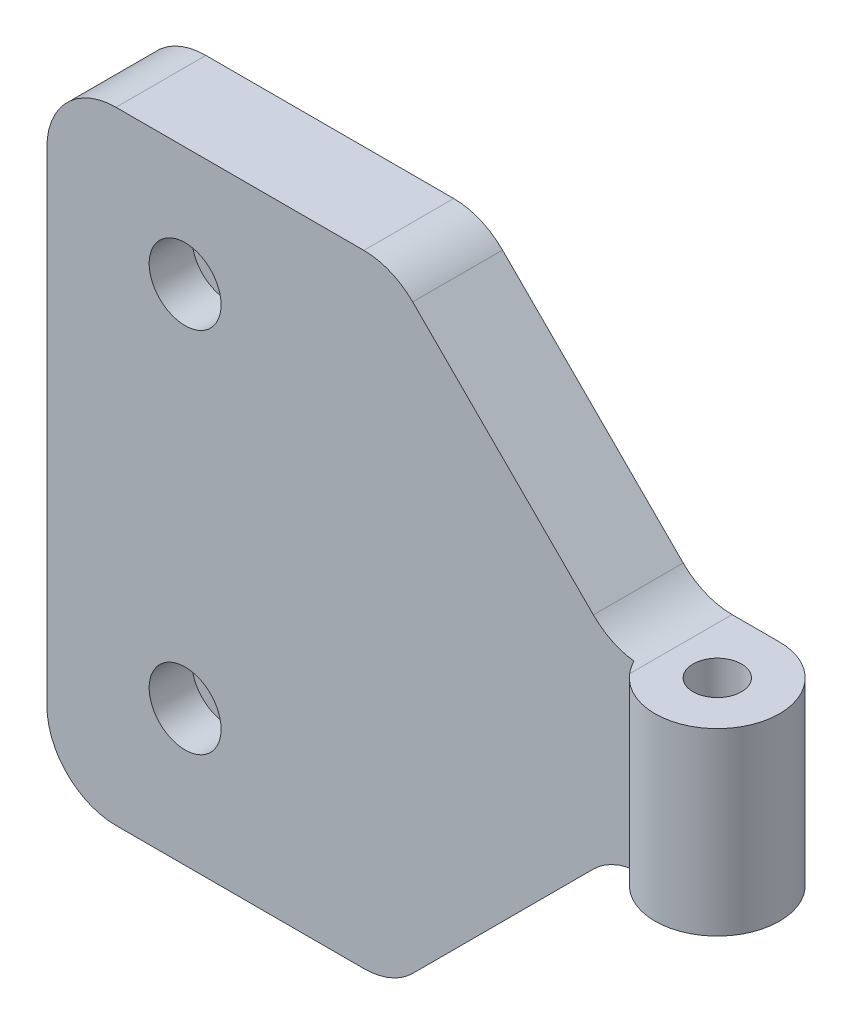
ISO-10303-21;
HEADER;
FILE_DESCRIPTION(('STEP AP214'),'2;1');
FILE_NAME('part.step','',(''),(''),'','','');
FILE_SCHEMA(('AUTOMOTIVE_DESIGN { 1 0 10303 214 1 1 1 1 }'));
ENDSEC;
DATA;
#1=APPLICATION_CONTEXT('core data for automotive mechanical design processes');
#2=APPLICATION_PROTOCOL_DEFINITION('international standard','automotive_design',2000,#1);
#3=PRODUCT_CONTEXT('',#1,'mechanical');
#4=PRODUCT('Part','Part','',(#3));
#5=PRODUCT_RELATED_PRODUCT_CATEGORY('part','',(#4));
#6=PRODUCT_DEFINITION_FORMATION('','',#4);
#7=PRODUCT_DEFINITION_CONTEXT('part definition',#1,'design');
#8=PRODUCT_DEFINITION('design','',#6,#7);
#9=PRODUCT_DEFINITION_SHAPE('','',#8);
#10=(LENGTH_UNIT() NAMED_UNIT(*) SI_UNIT(.MILLI.,.METRE.));
#11=(NAMED_UNIT(*) PLANE_ANGLE_UNIT() SI_UNIT($,.RADIAN.));
#12=(NAMED_UNIT(*) SI_UNIT($,.STERADIAN.) SOLID_ANGLE_UNIT());
#13=UNCERTAINTY_MEASURE_WITH_UNIT(LENGTH_MEASURE(1.E-05),#10,'distance_accuracy_value','');
#14=(GEOMETRIC_REPRESENTATION_CONTEXT(3) GLOBAL_UNCERTAINTY_ASSIGNED_CONTEXT((#13)) GLOBAL_UNIT_ASSIGNED_CONTEXT((#10,
#11,#12)) REPRESENTATION_CONTEXT('',''));
#15=CARTESIAN_POINT('',(0.,0.,0.));
#16=DIRECTION('',(0.,0.,1.));
#17=DIRECTION('',(1.,0.,0.));
#18=AXIS2_PLACEMENT_3D('',#15,#16,#17);
#19=CARTESIAN_POINT('',(0.,45.,-4.5));
#20=DIRECTION('',(0.,0.,-1.));
#21=DIRECTION('',(-1.,0.,0.));
#22=AXIS2_PLACEMENT_3D('',#19,#20,#21);
#23=PLANE('',#22);
#24=CARTESIAN_POINT('',(-36.5,36.4173359920842,-4.5));
#25=DIRECTION('',(0.,0.,-1.));
#26=DIRECTION('',(-1.,0.,0.));
#27=AXIS2_PLACEMENT_3D('',#24,#25,#26);
#28=CIRCLE('',#27,5.5);
#29=CARTESIAN_POINT('',(-42.,36.4173359920842,-4.5));
#30=VERTEX_POINT('',#29);
#31=EDGE_CURVE('E333',#30,#30,#28,.T.);
#32=ORIENTED_EDGE('',*,*,#31,.F.);
#33=EDGE_LOOP('',(#32));
#34=FACE_BOUND('',#33,.T.);
#35=CARTESIAN_POINT('',(-36.5,9.83294171594909,-4.5));
#36=DIRECTION('',(0.,0.,-1.));
#37=DIRECTION('',(-1.,0.,0.));
#38=AXIS2_PLACEMENT_3D('',#35,#36,#37);
#39=CIRCLE('',#38,5.5);
#40=CARTESIAN_POINT('',(-42.,9.83294171594909,-4.5));
#41=VERTEX_POINT('',#40);
#42=EDGE_CURVE('E324',#41,#41,#39,.T.);
#43=ORIENTED_EDGE('',*,*,#42,.F.);
#44=EDGE_LOOP('',(#43));
#45=FACE_BOUND('',#44,.T.);
#46=DIRECTION('',(0.707106781186544,0.707106781186551,0.));
#47=VECTOR('',#46,1.);
#48=CARTESIAN_POINT('',(-10.7500000000001,10.75,-4.5));
#49=LINE('',#48,#47);
#50=CARTESIAN_POINT('',(-20.0355339059327,1.46446609406728,-4.5));
#51=VERTEX_POINT('',#50);
#52=CARTESIAN_POINT('',(-6.96446609406744,14.5355339059327,-4.5));
#53=VERTEX_POINT('',#52);
#54=EDGE_CURVE('E327',#51,#53,#49,.T.);
#55=ORIENTED_EDGE('',*,*,#54,.F.);
#56=CARTESIAN_POINT('',(-23.5710678118655,5.,-4.5));
#57=DIRECTION('',(0.,0.,-1.));
#58=DIRECTION('',(-1.,0.,0.));
#59=AXIS2_PLACEMENT_3D('',#56,#57,#58);
#60=CIRCLE('',#59,5.);
#61=CARTESIAN_POINT('',(-23.5710678118655,0.,-4.5));
#62=VERTEX_POINT('',#61);
#63=EDGE_CURVE('E232',#51,#62,#60,.T.);
#64=ORIENTED_EDGE('',*,*,#63,.T.);
#65=DIRECTION('',(1.,0.,0.));
#66=VECTOR('',#65,1.);
#67=CARTESIAN_POINT('',(0.,0.,-4.5));
#68=LINE('',#67,#66);
#69=CARTESIAN_POINT('',(-41.5,0.,-4.5));
#70=VERTEX_POINT('',#69);
#71=EDGE_CURVE('E167',#70,#62,#68,.T.);
#72=ORIENTED_EDGE('',*,*,#71,.F.);
#73=CARTESIAN_POINT('',(-41.5,5.,-4.5));
#74=DIRECTION('',(0.,0.,-1.));
#75=DIRECTION('',(-1.,0.,0.));
#76=AXIS2_PLACEMENT_3D('',#73,#74,#75);
#77=CIRCLE('',#76,5.);
#78=CARTESIAN_POINT('',(-46.5,5.00000000000001,-4.5));
#79=VERTEX_POINT('',#78);
#80=EDGE_CURVE('E197',#70,#79,#77,.T.);
#81=ORIENTED_EDGE('',*,*,#80,.T.);
#82=DIRECTION('',(0.,-1.,0.));
#83=VECTOR('',#82,1.);
#84=CARTESIAN_POINT('',(-46.5,45.,-4.5));
#85=LINE('',#84,#83);
#86=CARTESIAN_POINT('',(-46.5,40.,-4.5));
#87=VERTEX_POINT('',#86);
#88=EDGE_CURVE('E189',#87,#79,#85,.T.);
#89=ORIENTED_EDGE('',*,*,#88,.F.);
#90=CARTESIAN_POINT('',(-41.5,40.,-4.5));
#91=DIRECTION('',(0.,0.,-1.));
#92=DIRECTION('',(-1.,0.,0.));
#93=AXIS2_PLACEMENT_3D('',#90,#91,#92);
#94=CIRCLE('',#93,5.);
#95=CARTESIAN_POINT('',(-41.5,45.,-4.5));
#96=VERTEX_POINT('',#95);
#97=EDGE_CURVE('E195',#87,#96,#94,.T.);
#98=ORIENTED_EDGE('',*,*,#97,.T.);
#99=DIRECTION('',(1.,0.,0.));
#100=VECTOR('',#99,1.);
#101=CARTESIAN_POINT('',(0.,45.,-4.5));
#102=LINE('',#101,#100);
#103=CARTESIAN_POINT('',(-23.5710678118655,45.,-4.5));
#104=VERTEX_POINT('',#103);
#105=EDGE_CURVE('E177',#96,#104,#102,.T.);
#106=ORIENTED_EDGE('',*,*,#105,.T.);
#107=CARTESIAN_POINT('',(-23.5710678118655,40.,-4.5));
#108=DIRECTION('',(0.,0.,-1.));
#109=DIRECTION('',(-1.,0.,0.));
#110=AXIS2_PLACEMENT_3D('',#107,#108,#109);
#111=CIRCLE('',#110,5.);
#112=CARTESIAN_POINT('',(-20.0355339059327,43.5355339059327,-4.5));
#113=VERTEX_POINT('',#112);
#114=EDGE_CURVE('E230',#104,#113,#111,.T.);
#115=ORIENTED_EDGE('',*,*,#114,.T.);
#116=DIRECTION('',(-0.707106781186543,0.707106781186552,0.));
#117=VECTOR('',#116,1.);
#118=CARTESIAN_POINT('',(11.7499999999999,11.7499999999997,-4.5));
#119=LINE('',#118,#117);
#120=CARTESIAN_POINT('',(-6.96446609406744,30.4644660940673,-4.5));
#121=VERTEX_POINT('',#120);
#122=EDGE_CURVE('E628',#121,#113,#119,.T.);
#123=ORIENTED_EDGE('',*,*,#122,.F.);
#124=CARTESIAN_POINT('',(-3.42893218813469,34.,-4.5));
#125=DIRECTION('',(0.,0.,-1.));
#126=DIRECTION('',(-1.,0.,0.));
#127=AXIS2_PLACEMENT_3D('',#124,#125,#126);
#128=CIRCLE('',#127,5.);
#129=CARTESIAN_POINT('',(-3.42893218813469,29.,-4.5));
#130=VERTEX_POINT('',#129);
#131=EDGE_CURVE('E149',#121,#130,#128,.F.);
#132=ORIENTED_EDGE('',*,*,#131,.T.);
#133=DIRECTION('',(1.,0.,0.));
#134=VECTOR('',#133,1.);
#135=CARTESIAN_POINT('',(0.,29.,-4.5));
#136=LINE('',#135,#134);
#137=CARTESIAN_POINT('',(0.,29.,-4.5));
#138=VERTEX_POINT('',#137);
#139=EDGE_CURVE('E142',#130,#138,#136,.T.);
#140=ORIENTED_EDGE('',*,*,#139,.T.);
#141=DIRECTION('',(0.,-1.,0.));
#142=VECTOR('',#141,1.);
#143=CARTESIAN_POINT('',(0.,29.,-4.5));
#144=LINE('',#143,#142);
#145=CARTESIAN_POINT('',(0.,16.,-4.5));
#146=VERTEX_POINT('',#145);
#147=EDGE_CURVE('E147',#146,#138,#144,.F.);
#148=ORIENTED_EDGE('',*,*,#147,.F.);
#149=DIRECTION('',(1.,0.,0.));
#150=VECTOR('',#149,1.);
#151=CARTESIAN_POINT('',(0.,16.,-4.5));
#152=LINE('',#151,#150);
#153=CARTESIAN_POINT('',(-3.42893218813468,16.,-4.5));
#154=VERTEX_POINT('',#153);
#155=EDGE_CURVE('E341',#154,#146,#152,.T.);
#156=ORIENTED_EDGE('',*,*,#155,.F.);
#157=CARTESIAN_POINT('',(-3.42893218813468,11.,-4.5));
#158=DIRECTION('',(0.,0.,-1.));
#159=DIRECTION('',(-1.,0.,0.));
#160=AXIS2_PLACEMENT_3D('',#157,#158,#159);
#161=CIRCLE('',#160,5.);
#162=EDGE_CURVE('E627',#154,#53,#161,.F.);
#163=ORIENTED_EDGE('',*,*,#162,.T.);
#164=EDGE_LOOP('',(#55,#64,#72,#81,#89,#98,#106,#115,#123,#132,#140,#148,#156,#163));
#165=FACE_BOUND('',#164,.T.);
#166=ADVANCED_FACE('F39',(#34,#45,#165),#23,.T.);
#167=CARTESIAN_POINT('',(0.,45.,2.));
#168=DIRECTION('',(0.,0.,-1.));
#169=DIRECTION('',(-1.,0.,0.));
#170=AXIS2_PLACEMENT_3D('',#167,#168,#169);
#171=PLANE('',#170);
#172=CARTESIAN_POINT('',(-36.5,36.4173359920842,2.));
#173=DIRECTION('',(0.,0.,1.));
#174=DIRECTION('',(1.,0.,0.));
#175=AXIS2_PLACEMENT_3D('',#172,#173,#174);
#176=CIRCLE('',#175,2.6);
#177=CARTESIAN_POINT('',(-33.9,36.4173359920842,2.));
#178=VERTEX_POINT('',#177);
#179=EDGE_CURVE('E338',#178,#178,#176,.T.);
#180=ORIENTED_EDGE('',*,*,#179,.F.);
#181=EDGE_LOOP('',(#180));
#182=FACE_BOUND('',#181,.T.);
#183=CARTESIAN_POINT('',(-36.5,9.83294171594909,2.));
#184=DIRECTION('',(0.,0.,1.));
#185=DIRECTION('',(1.,0.,0.));
#186=AXIS2_PLACEMENT_3D('',#183,#184,#185);
#187=CIRCLE('',#186,2.6);
#188=CARTESIAN_POINT('',(-33.9,9.83294171594909,2.));
#189=VERTEX_POINT('',#188);
#190=EDGE_CURVE('E152',#189,#189,#187,.T.);
#191=ORIENTED_EDGE('',*,*,#190,.F.);
#192=EDGE_LOOP('',(#191));
#193=FACE_BOUND('',#192,.T.);
#194=DIRECTION('',(1.,0.,0.));
#195=VECTOR('',#194,1.);
#196=CARTESIAN_POINT('',(0.,0.,2.));
#197=LINE('',#196,#195);
#198=CARTESIAN_POINT('',(-41.5,0.,2.));
#199=VERTEX_POINT('',#198);
#200=CARTESIAN_POINT('',(-23.5710678118655,0.,2.));
#201=VERTEX_POINT('',#200);
#202=EDGE_CURVE('E170',#199,#201,#197,.T.);
#203=ORIENTED_EDGE('',*,*,#202,.T.);
#204=CARTESIAN_POINT('',(-23.5710678118655,5.,2.));
#205=DIRECTION('',(0.,0.,-1.));
#206=DIRECTION('',(-1.,0.,0.));
#207=AXIS2_PLACEMENT_3D('',#204,#205,#206);
#208=CIRCLE('',#207,5.);
#209=CARTESIAN_POINT('',(-20.0355339059327,1.46446609406729,2.));
#210=VERTEX_POINT('',#209);
#211=EDGE_CURVE('E238',#201,#210,#208,.F.);
#212=ORIENTED_EDGE('',*,*,#211,.T.);
#213=DIRECTION('',(0.707106781186544,0.707106781186551,0.));
#214=VECTOR('',#213,1.);
#215=CARTESIAN_POINT('',(11.7499999999999,33.2500000000002,2.));
#216=LINE('',#215,#214);
#217=CARTESIAN_POINT('',(-6.96446609406744,14.5355339059327,2.));
#218=VERTEX_POINT('',#217);
#219=EDGE_CURVE('E314',#210,#218,#216,.T.);
#220=ORIENTED_EDGE('',*,*,#219,.T.);
#221=CARTESIAN_POINT('',(-3.42893218813468,11.,2.));
#222=DIRECTION('',(0.,0.,-1.));
#223=DIRECTION('',(-1.,0.,0.));
#224=AXIS2_PLACEMENT_3D('',#221,#222,#223);
#225=CIRCLE('',#224,5.);
#226=CARTESIAN_POINT('',(-4.03112887414927,15.963603444208,2.));
#227=VERTEX_POINT('',#226);
#228=EDGE_CURVE('E53',#218,#227,#225,.T.);
#229=ORIENTED_EDGE('',*,*,#228,.T.);
#230=DIRECTION('',(0.,-1.,0.));
#231=VECTOR('',#230,1.);
#232=CARTESIAN_POINT('',(-4.03112887414927,45.,2.));
#233=LINE('',#232,#231);
#234=CARTESIAN_POINT('',(-4.03112887414927,29.036396555792,2.));
#235=VERTEX_POINT('',#234);
#236=EDGE_CURVE('E59',#235,#227,#233,.T.);
#237=ORIENTED_EDGE('',*,*,#236,.F.);
#238=CARTESIAN_POINT('',(-3.42893218813469,34.,2.));
#239=DIRECTION('',(0.,0.,-1.));
#240=DIRECTION('',(-1.,0.,0.));
#241=AXIS2_PLACEMENT_3D('',#238,#239,#240);
#242=CIRCLE('',#241,5.);
#243=CARTESIAN_POINT('',(-6.96446609406744,30.4644660940673,2.));
#244=VERTEX_POINT('',#243);
#245=EDGE_CURVE('E251',#235,#244,#242,.T.);
#246=ORIENTED_EDGE('',*,*,#245,.T.);
#247=DIRECTION('',(-0.707106781186543,0.707106781186552,0.));
#248=VECTOR('',#247,1.);
#249=CARTESIAN_POINT('',(-10.7500000000001,34.25,2.));
#250=LINE('',#249,#248);
#251=CARTESIAN_POINT('',(-20.0355339059327,43.5355339059327,2.));
#252=VERTEX_POINT('',#251);
#253=EDGE_CURVE('E321',#244,#252,#250,.T.);
#254=ORIENTED_EDGE('',*,*,#253,.T.);
#255=CARTESIAN_POINT('',(-23.5710678118655,40.,2.));
#256=DIRECTION('',(0.,0.,-1.));
#257=DIRECTION('',(-1.,0.,0.));
#258=AXIS2_PLACEMENT_3D('',#255,#256,#257);
#259=CIRCLE('',#258,5.);
#260=CARTESIAN_POINT('',(-23.5710678118655,45.,2.));
#261=VERTEX_POINT('',#260);
#262=EDGE_CURVE('E236',#252,#261,#259,.F.);
#263=ORIENTED_EDGE('',*,*,#262,.T.);
#264=DIRECTION('',(1.,0.,0.));
#265=VECTOR('',#264,1.);
#266=CARTESIAN_POINT('',(0.,45.,2.));
#267=LINE('',#266,#265);
#268=CARTESIAN_POINT('',(-41.5,45.,2.));
#269=VERTEX_POINT('',#268);
#270=EDGE_CURVE('E180',#269,#261,#267,.T.);
#271=ORIENTED_EDGE('',*,*,#270,.F.);
#272=CARTESIAN_POINT('',(-41.5,40.,2.));
#273=DIRECTION('',(0.,0.,-1.));
#274=DIRECTION('',(-1.,0.,0.));
#275=AXIS2_PLACEMENT_3D('',#272,#273,#274);
#276=CIRCLE('',#275,5.);
#277=CARTESIAN_POINT('',(-46.5,40.,2.));
#278=VERTEX_POINT('',#277);
#279=EDGE_CURVE('E204',#269,#278,#276,.F.);
#280=ORIENTED_EDGE('',*,*,#279,.T.);
#281=DIRECTION('',(0.,-1.,0.));
#282=VECTOR('',#281,1.);
#283=CARTESIAN_POINT('',(-46.5,45.,2.));
#284=LINE('',#283,#282);
#285=CARTESIAN_POINT('',(-46.5,5.00000000000001,2.));
#286=VERTEX_POINT('',#285);
#287=EDGE_CURVE('E186',#278,#286,#284,.T.);
#288=ORIENTED_EDGE('',*,*,#287,.T.);
#289=CARTESIAN_POINT('',(-41.5,5.,2.));
#290=DIRECTION('',(0.,0.,-1.));
#291=DIRECTION('',(-1.,0.,0.));
#292=AXIS2_PLACEMENT_3D('',#289,#290,#291);
#293=CIRCLE('',#292,5.);
#294=EDGE_CURVE('E206',#286,#199,#293,.F.);
#295=ORIENTED_EDGE('',*,*,#294,.T.);
#296=EDGE_LOOP('',(#203,#212,#220,#229,#237,#246,#254,#263,#271,#280,#288,#295));
#297=FACE_BOUND('',#296,.T.);
#298=ADVANCED_FACE('F277',(#182,#193,#297),#171,.F.);
#299=CARTESIAN_POINT('',(-36.5,9.83294171594909,-13.));
#300=DIRECTION('',(0.,0.,1.));
#301=DIRECTION('',(1.,0.,0.));
#302=AXIS2_PLACEMENT_3D('',#299,#300,#301);
#303=CYLINDRICAL_SURFACE('',#302,2.6);
#304=ORIENTED_EDGE('',*,*,#190,.T.);
#305=EDGE_LOOP('',(#304));
#306=FACE_BOUND('',#305,.T.);
#307=CARTESIAN_POINT('',(-36.5,9.83294171594909,-1.1));
#308=DIRECTION('',(0.,0.,-1.));
#309=DIRECTION('',(-1.,0.,0.));
#310=AXIS2_PLACEMENT_3D('',#307,#308,#309);
#311=CIRCLE('',#310,2.6);
#312=CARTESIAN_POINT('',(-39.1,9.83294171594909,-1.1));
#313=VERTEX_POINT('',#312);
#314=EDGE_CURVE('E213',#313,#313,#311,.F.);
#315=ORIENTED_EDGE('',*,*,#314,.F.);
#316=EDGE_LOOP('',(#315));
#317=FACE_BOUND('',#316,.T.);
#318=ADVANCED_FACE('F283',(#306,#317),#303,.F.);
#319=CARTESIAN_POINT('',(-36.5,36.4173359920842,-13.));
#320=DIRECTION('',(0.,0.,1.));
#321=DIRECTION('',(1.,0.,0.));
#322=AXIS2_PLACEMENT_3D('',#319,#320,#321);
#323=CYLINDRICAL_SURFACE('',#322,2.6);
#324=ORIENTED_EDGE('',*,*,#179,.T.);
#325=EDGE_LOOP('',(#324));
#326=FACE_BOUND('',#325,.T.);
#327=CARTESIAN_POINT('',(-36.5,36.4173359920842,-1.1));
#328=DIRECTION('',(0.,0.,-1.));
#329=DIRECTION('',(-1.,0.,0.));
#330=AXIS2_PLACEMENT_3D('',#327,#328,#329);
#331=CIRCLE('',#330,2.6);
#332=CARTESIAN_POINT('',(-39.1,36.4173359920842,-1.1));
#333=VERTEX_POINT('',#332);
#334=EDGE_CURVE('E210',#333,#333,#331,.F.);
#335=ORIENTED_EDGE('',*,*,#334,.F.);
#336=EDGE_LOOP('',(#335));
#337=FACE_BOUND('',#336,.T.);
#338=ADVANCED_FACE('F360',(#326,#337),#323,.F.);
#339=CARTESIAN_POINT('',(-46.5,45.,0.));
#340=DIRECTION('',(-1.,0.,0.));
#341=DIRECTION('',(0.,0.,1.));
#342=AXIS2_PLACEMENT_3D('',#339,#340,#341);
#343=PLANE('',#342);
#344=ORIENTED_EDGE('',*,*,#88,.T.);
#345=DIRECTION('',(0.,0.,-1.));
#346=VECTOR('',#345,1.);
#347=CARTESIAN_POINT('',(-46.5,5.,2.));
#348=LINE('',#347,#346);
#349=EDGE_CURVE('E202',#79,#286,#348,.F.);
#350=ORIENTED_EDGE('',*,*,#349,.T.);
#351=ORIENTED_EDGE('',*,*,#287,.F.);
#352=DIRECTION('',(0.,0.,-1.));
#353=VECTOR('',#352,1.);
#354=CARTESIAN_POINT('',(-46.5,40.,0.));
#355=LINE('',#354,#353);
#356=EDGE_CURVE('E199',#278,#87,#355,.T.);
#357=ORIENTED_EDGE('',*,*,#356,.T.);
#358=EDGE_LOOP('',(#344,#350,#351,#357));
#359=FACE_BOUND('',#358,.T.);
#360=ADVANCED_FACE('F289',(#359),#343,.T.);
#361=CARTESIAN_POINT('',(0.,45.,0.));
#362=DIRECTION('',(0.,1.,0.));
#363=DIRECTION('',(0.,0.,1.));
#364=AXIS2_PLACEMENT_3D('',#361,#362,#363);
#365=PLANE('',#364);
#366=ORIENTED_EDGE('',*,*,#270,.T.);
#367=DIRECTION('',(0.,0.,-1.));
#368=VECTOR('',#367,1.);
#369=CARTESIAN_POINT('',(-23.5710678118655,45.,-4.5));
#370=LINE('',#369,#368);
#371=EDGE_CURVE('E240',#261,#104,#370,.T.);
#372=ORIENTED_EDGE('',*,*,#371,.T.);
#373=ORIENTED_EDGE('',*,*,#105,.F.);
#374=DIRECTION('',(0.,0.,-1.));
#375=VECTOR('',#374,1.);
#376=CARTESIAN_POINT('',(-41.5,45.,0.));
#377=LINE('',#376,#375);
#378=EDGE_CURVE('E208',#96,#269,#377,.F.);
#379=ORIENTED_EDGE('',*,*,#378,.T.);
#380=EDGE_LOOP('',(#366,#372,#373,#379));
#381=FACE_BOUND('',#380,.T.);
#382=ADVANCED_FACE('F541',(#381),#365,.T.);
#383=CARTESIAN_POINT('',(0.,0.,0.));
#384=DIRECTION('',(0.,1.,0.));
#385=DIRECTION('',(0.,0.,1.));
#386=AXIS2_PLACEMENT_3D('',#383,#384,#385);
#387=PLANE('',#386);
#388=ORIENTED_EDGE('',*,*,#71,.T.);
#389=DIRECTION('',(0.,0.,-1.));
#390=VECTOR('',#389,1.);
#391=CARTESIAN_POINT('',(-23.5710678118655,0.,0.));
#392=LINE('',#391,#390);
#393=EDGE_CURVE('E234',#62,#201,#392,.F.);
#394=ORIENTED_EDGE('',*,*,#393,.T.);
#395=ORIENTED_EDGE('',*,*,#202,.F.);
#396=DIRECTION('',(0.,0.,-1.));
#397=VECTOR('',#396,1.);
#398=CARTESIAN_POINT('',(-41.5,0.,-4.5));
#399=LINE('',#398,#397);
#400=EDGE_CURVE('E192',#199,#70,#399,.T.);
#401=ORIENTED_EDGE('',*,*,#400,.T.);
#402=EDGE_LOOP('',(#388,#394,#395,#401));
#403=FACE_BOUND('',#402,.T.);
#404=ADVANCED_FACE('F308',(#403),#387,.F.);
#405=CARTESIAN_POINT('',(0.,29.,0.));
#406=DIRECTION('',(0.,-1.,0.));
#407=DIRECTION('',(0.,0.,-1.));
#408=AXIS2_PLACEMENT_3D('',#405,#406,#407);
#409=CYLINDRICAL_SURFACE('',#408,4.5);
#410=ORIENTED_EDGE('',*,*,#236,.T.);
#411=CARTESIAN_POINT('',(-4.03112887414927,15.963603444208,2.));
#412=CARTESIAN_POINT('',(-3.99044075026024,15.9685359860328,2.08201601896047));
#413=CARTESIAN_POINT('',(-3.94723840239108,15.9732735935633,2.16279984020572));
#414=CARTESIAN_POINT('',(-3.85614500221616,15.9819257381548,2.32130627109028));
#415=CARTESIAN_POINT('',(-3.80827278910433,15.9858433968808,2.39903954044826));
#416=CARTESIAN_POINT('',(-3.70785952142706,15.9924672480451,2.55149124831842));
#417=CARTESIAN_POINT('',(-3.65531831770198,15.9951734017629,2.62620959040215));
#418=CARTESIAN_POINT('',(-3.54555657951766,15.9989420566335,2.77262370194589));
#419=CARTESIAN_POINT('',(-3.48831861620373,15.999998114718,2.8443065649609));
#420=CARTESIAN_POINT('',(-3.42893218813468,16.,2.91417639294088));
#421=B_SPLINE_CURVE_WITH_KNOTS('',3,(#411,#412,#413,#414,#415,#416,#417,#418,#419,#420),
.UNSPECIFIED.,.F.,.F.,(4,2,2,2,4),(0.,0.275022367969424,0.548977833343628,0.822942053886143,
1.09797336284784),.UNSPECIFIED.);
#422=CARTESIAN_POINT('',(-3.42893218813468,16.,2.91417639294088));
#423=VERTEX_POINT('',#422);
#424=EDGE_CURVE('E11',#227,#423,#421,.T.);
#425=ORIENTED_EDGE('',*,*,#424,.T.);
#426=CARTESIAN_POINT('',(0.,16.,0.));
#427=DIRECTION('',(0.,1.,0.));
#428=DIRECTION('',(0.,0.,1.));
#429=AXIS2_PLACEMENT_3D('',#426,#427,#428);
#430=CIRCLE('',#429,4.5);
#431=EDGE_CURVE('E165',#423,#146,#430,.T.);
#432=ORIENTED_EDGE('',*,*,#431,.T.);
#433=ORIENTED_EDGE('',*,*,#147,.T.);
#434=CARTESIAN_POINT('',(0.,29.,0.));
#435=DIRECTION('',(0.,1.,0.));
#436=DIRECTION('',(0.,0.,1.));
#437=AXIS2_PLACEMENT_3D('',#434,#435,#436);
#438=CIRCLE('',#437,4.5);
#439=CARTESIAN_POINT('',(-3.42893218813469,29.,2.91417639294087));
#440=VERTEX_POINT('',#439);
#441=EDGE_CURVE('E156',#440,#138,#438,.T.);
#442=ORIENTED_EDGE('',*,*,#441,.F.);
#443=CARTESIAN_POINT('',(-3.42893218813469,29.,2.91417639294087));
#444=CARTESIAN_POINT('',(-3.48831861620374,29.000001885282,2.84430656496089));
#445=CARTESIAN_POINT('',(-3.54555657951766,29.0010579433665,2.77262370194588));
#446=CARTESIAN_POINT('',(-3.65531831770198,29.0048265982371,2.62620959040215));
#447=CARTESIAN_POINT('',(-3.70785952142706,29.0075327519549,2.55149124831842));
#448=CARTESIAN_POINT('',(-3.80827278910433,29.0141566031192,2.39903954044826));
#449=CARTESIAN_POINT('',(-3.85614500221616,29.0180742618452,2.32130627109028));
#450=CARTESIAN_POINT('',(-3.94723840239108,29.0267264064367,2.16279984020572));
#451=CARTESIAN_POINT('',(-3.99044075026024,29.0314640139672,2.08201601896047));
#452=CARTESIAN_POINT('',(-4.03112887414927,29.036396555792,2.));
#453=B_SPLINE_CURVE_WITH_KNOTS('',3,(#443,#444,#445,#446,#447,#448,#449,#450,#451,#452),
.UNSPECIFIED.,.F.,.F.,(4,2,2,2,4),(0.,0.275031308961691,0.548995529504205,0.822950994878407,
1.09797336284783),.UNSPECIFIED.);
#454=EDGE_CURVE('E244',#440,#235,#453,.T.);
#455=ORIENTED_EDGE('',*,*,#454,.T.);
#456=EDGE_LOOP('',(#410,#425,#432,#433,#442,#455));
#457=FACE_BOUND('',#456,.T.);
#458=ADVANCED_FACE('F163',(#457),#409,.T.);
#459=CARTESIAN_POINT('',(0.,29.,0.));
#460=DIRECTION('',(0.,-1.,0.));
#461=DIRECTION('',(0.,0.,-1.));
#462=AXIS2_PLACEMENT_3D('',#459,#460,#461);
#463=CYLINDRICAL_SURFACE('',#462,1.75);
#464=CARTESIAN_POINT('',(0.,29.,0.));
#465=DIRECTION('',(0.,1.,0.));
#466=DIRECTION('',(0.,0.,1.));
#467=AXIS2_PLACEMENT_3D('',#464,#465,#466);
#468=CIRCLE('',#467,1.75);
#469=CARTESIAN_POINT('',(0.,29.,-1.75));
#470=VERTEX_POINT('',#469);
#471=EDGE_CURVE('E160',#470,#470,#468,.T.);
#472=CARTESIAN_POINT('',(0.,16.,0.));
#473=DIRECTION('',(0.,1.,0.));
#474=DIRECTION('',(0.,0.,1.));
#475=AXIS2_PLACEMENT_3D('',#472,#473,#474);
#476=CIRCLE('',#475,1.75);
#477=CARTESIAN_POINT('',(0.,16.,-1.75));
#478=VERTEX_POINT('',#477);
#479=EDGE_CURVE('E161',#478,#478,#476,.T.);
#480=CARTESIAN_POINT('',(0.,29.,-1.75));
#481=CARTESIAN_POINT('',(0.,28.8645833333333,-1.75));
#482=CARTESIAN_POINT('',(0.,28.7291666666667,-1.75));
#483=CARTESIAN_POINT('',(0.,28.4583333333333,-1.75));
#484=CARTESIAN_POINT('',(0.,28.3229166666667,-1.75));
#485=CARTESIAN_POINT('',(0.,28.0520833333333,-1.75));
#486=CARTESIAN_POINT('',(0.,27.9166666666667,-1.75));
#487=CARTESIAN_POINT('',(0.,27.6458333333333,-1.75));
#488=CARTESIAN_POINT('',(0.,27.5104166666667,-1.75));
#489=CARTESIAN_POINT('',(0.,27.2395833333333,-1.75));
#490=CARTESIAN_POINT('',(0.,27.1041666666667,-1.75));
#491=CARTESIAN_POINT('',(0.,26.8333333333333,-1.75));
#492=CARTESIAN_POINT('',(0.,26.6979166666667,-1.75));
#493=CARTESIAN_POINT('',(0.,26.4270833333333,-1.75));
#494=CARTESIAN_POINT('',(0.,26.2916666666667,-1.75));
#495=CARTESIAN_POINT('',(0.,26.0208333333333,-1.75));
#496=CARTESIAN_POINT('',(0.,25.8854166666667,-1.75));
#497=CARTESIAN_POINT('',(0.,25.6145833333333,-1.75));
#498=CARTESIAN_POINT('',(0.,25.4791666666667,-1.75));
#499=CARTESIAN_POINT('',(0.,25.2083333333333,-1.75));
#500=CARTESIAN_POINT('',(0.,25.0729166666667,-1.75));
#501=CARTESIAN_POINT('',(0.,24.8020833333333,-1.75));
#502=CARTESIAN_POINT('',(0.,24.6666666666667,-1.75));
#503=CARTESIAN_POINT('',(0.,24.3958333333333,-1.75));
#504=CARTESIAN_POINT('',(0.,24.2604166666667,-1.75));
#505=CARTESIAN_POINT('',(0.,23.9895833333333,-1.75));
#506=CARTESIAN_POINT('',(0.,23.8541666666667,-1.75));
#507=CARTESIAN_POINT('',(0.,23.5833333333333,-1.75));
#508=CARTESIAN_POINT('',(0.,23.4479166666667,-1.75));
#509=CARTESIAN_POINT('',(0.,23.1770833333333,-1.75));
#510=CARTESIAN_POINT('',(0.,23.0416666666667,-1.75));
#511=CARTESIAN_POINT('',(0.,22.7708333333333,-1.75));
#512=CARTESIAN_POINT('',(0.,22.6354166666667,-1.75));
#513=CARTESIAN_POINT('',(0.,22.3645833333333,-1.75));
#514=CARTESIAN_POINT('',(0.,22.2291666666667,-1.75));
#515=CARTESIAN_POINT('',(0.,21.9583333333333,-1.75));
#516=CARTESIAN_POINT('',(0.,21.8229166666667,-1.75));
#517=CARTESIAN_POINT('',(0.,21.5520833333333,-1.75));
#518=CARTESIAN_POINT('',(0.,21.4166666666667,-1.75));
#519=CARTESIAN_POINT('',(0.,21.1458333333333,-1.75));
#520=CARTESIAN_POINT('',(0.,21.0104166666667,-1.75));
#521=CARTESIAN_POINT('',(0.,20.7395833333333,-1.75));
#522=CARTESIAN_POINT('',(0.,20.6041666666667,-1.75));
#523=CARTESIAN_POINT('',(0.,20.3333333333333,-1.75));
#524=CARTESIAN_POINT('',(0.,20.1979166666667,-1.75));
#525=CARTESIAN_POINT('',(0.,19.9270833333333,-1.75));
#526=CARTESIAN_POINT('',(0.,19.7916666666667,-1.75));
#527=CARTESIAN_POINT('',(0.,19.5208333333333,-1.75));
#528=CARTESIAN_POINT('',(0.,19.3854166666667,-1.75));
#529=CARTESIAN_POINT('',(0.,19.1145833333333,-1.75));
#530=CARTESIAN_POINT('',(0.,18.9791666666667,-1.75));
#531=CARTESIAN_POINT('',(0.,18.7083333333333,-1.75));
#532=CARTESIAN_POINT('',(0.,18.5729166666667,-1.75));
#533=CARTESIAN_POINT('',(0.,18.3020833333333,-1.75));
#534=CARTESIAN_POINT('',(0.,18.1666666666667,-1.75));
#535=CARTESIAN_POINT('',(0.,17.8958333333333,-1.75));
#536=CARTESIAN_POINT('',(0.,17.7604166666667,-1.75));
#537=CARTESIAN_POINT('',(0.,17.4895833333333,-1.75));
#538=CARTESIAN_POINT('',(0.,17.3541666666667,-1.75));
#539=CARTESIAN_POINT('',(0.,17.0833333333333,-1.75));
#540=CARTESIAN_POINT('',(0.,16.9479166666667,-1.75));
#541=CARTESIAN_POINT('',(0.,16.6770833333333,-1.75));
#542=CARTESIAN_POINT('',(0.,16.5416666666667,-1.75));
#543=CARTESIAN_POINT('',(0.,16.2708333333333,-1.75));
#544=CARTESIAN_POINT('',(0.,16.1354166666667,-1.75));
#545=CARTESIAN_POINT('',(0.,16.,-1.75));
#546=B_SPLINE_CURVE_WITH_KNOTS('',3,(#480,#481,#482,#483,#484,#485,#486,#487,#488,#489,#490,
#491,#492,#493,#494,#495,#496,#497,#498,#499,#500,#501,#502,#503,#504,#505,#506,#507,#508,#509,
#510,#511,#512,#513,#514,#515,#516,#517,#518,#519,#520,#521,#522,#523,#524,#525,#526,#527,#528,
#529,#530,#531,#532,#533,#534,#535,#536,#537,#538,#539,#540,#541,#542,#543,#544,#545),
.UNSPECIFIED.,.F.,.F.,(4,2,2,2,2,2,2,2,2,2,2,2,2,2,2,2,2,2,2,2,2,2,2,2,2,2,2,2,2,2,2,2,4),(0.,
0.406249999999997,0.812499999999997,1.21875,1.625,2.03125,2.4375,2.84375,3.25,3.65625,4.0625,
4.46875,4.875,5.28125,5.6875,6.09375,6.5,6.90625,7.3125,7.71875,8.125,8.53124999999999,8.9375,
9.34374999999999,9.75,10.15625,10.5625,10.96875,11.375,11.78125,12.1875,12.59375,13.),.UNSPECIFIED.);
#547=EDGE_CURVE('BSEAM348',#470,#478,#546,.T.);
#548=ORIENTED_EDGE('',*,*,#471,.T.);
#549=ORIENTED_EDGE('',*,*,#479,.F.);
#550=ORIENTED_EDGE('',*,*,#547,.T.);
#551=ORIENTED_EDGE('',*,*,#547,.F.);
#552=EDGE_LOOP('',(#548,#550,#549,#551));
#553=FACE_BOUND('',#552,.T.);
#554=ADVANCED_FACE('F348',(#553),#463,.F.);
#555=CARTESIAN_POINT('',(0.,29.,0.));
#556=DIRECTION('',(0.,1.,0.));
#557=DIRECTION('',(0.,0.,1.));
#558=AXIS2_PLACEMENT_3D('',#555,#556,#557);
#559=PLANE('',#558);
#560=ORIENTED_EDGE('',*,*,#471,.F.);
#561=EDGE_LOOP('',(#560));
#562=FACE_BOUND('',#561,.T.);
#563=ORIENTED_EDGE('',*,*,#139,.F.);
#564=DIRECTION('',(0.,0.,-1.));
#565=VECTOR('',#564,1.);
#566=CARTESIAN_POINT('',(-3.42893218813469,29.,0.));
#567=LINE('',#566,#565);
#568=EDGE_CURVE('E158',#130,#440,#567,.F.);
#569=ORIENTED_EDGE('',*,*,#568,.T.);
#570=ORIENTED_EDGE('',*,*,#441,.T.);
#571=EDGE_LOOP('',(#563,#569,#570));
#572=FACE_BOUND('',#571,.T.);
#573=ADVANCED_FACE('F157',(#562,#572),#559,.T.);
#574=CARTESIAN_POINT('',(0.,16.,0.));
#575=DIRECTION('',(0.,1.,0.));
#576=DIRECTION('',(0.,0.,1.));
#577=AXIS2_PLACEMENT_3D('',#574,#575,#576);
#578=PLANE('',#577);
#579=ORIENTED_EDGE('',*,*,#431,.F.);
#580=DIRECTION('',(0.,0.,-1.));
#581=VECTOR('',#580,1.);
#582=CARTESIAN_POINT('',(-3.42893218813468,16.,-4.5));
#583=LINE('',#582,#581);
#584=EDGE_CURVE('E222',#423,#154,#583,.T.);
#585=ORIENTED_EDGE('',*,*,#584,.T.);
#586=ORIENTED_EDGE('',*,*,#155,.T.);
#587=EDGE_LOOP('',(#579,#585,#586));
#588=FACE_BOUND('',#587,.T.);
#589=ORIENTED_EDGE('',*,*,#479,.T.);
#590=EDGE_LOOP('',(#589));
#591=FACE_BOUND('',#590,.T.);
#592=ADVANCED_FACE('F292',(#588,#591),#578,.F.);
#593=CARTESIAN_POINT('',(-41.5,5.,0.));
#594=DIRECTION('',(0.,0.,1.));
#595=DIRECTION('',(1.,0.,0.));
#596=AXIS2_PLACEMENT_3D('',#593,#594,#595);
#597=CYLINDRICAL_SURFACE('',#596,5.);
#598=ORIENTED_EDGE('',*,*,#294,.F.);
#599=ORIENTED_EDGE('',*,*,#349,.F.);
#600=ORIENTED_EDGE('',*,*,#80,.F.);
#601=ORIENTED_EDGE('',*,*,#400,.F.);
#602=EDGE_LOOP('',(#598,#599,#600,#601));
#603=FACE_BOUND('',#602,.T.);
#604=ADVANCED_FACE('F290',(#603),#597,.T.);
#605=CARTESIAN_POINT('',(-41.5,40.,0.));
#606=DIRECTION('',(0.,0.,-1.));
#607=DIRECTION('',(-1.,0.,0.));
#608=AXIS2_PLACEMENT_3D('',#605,#606,#607);
#609=CYLINDRICAL_SURFACE('',#608,5.);
#610=ORIENTED_EDGE('',*,*,#279,.F.);
#611=ORIENTED_EDGE('',*,*,#378,.F.);
#612=ORIENTED_EDGE('',*,*,#97,.F.);
#613=ORIENTED_EDGE('',*,*,#356,.F.);
#614=EDGE_LOOP('',(#610,#611,#612,#613));
#615=FACE_BOUND('',#614,.T.);
#616=ADVANCED_FACE('F263',(#615),#609,.T.);
#617=CARTESIAN_POINT('',(-36.5,36.4173359920842,-1.5));
#618=DIRECTION('',(0.,0.,-1.));
#619=DIRECTION('',(-1.,0.,0.));
#620=AXIS2_PLACEMENT_3D('',#617,#618,#619);
#621=PLANE('',#620);
#622=CARTESIAN_POINT('',(-36.5,36.4173359920842,-1.5));
#623=DIRECTION('',(0.,0.,-1.));
#624=DIRECTION('',(-1.,0.,0.));
#625=AXIS2_PLACEMENT_3D('',#622,#623,#624);
#626=CIRCLE('',#625,5.5);
#627=CARTESIAN_POINT('',(-42.,36.4173359920842,-1.5));
#628=VERTEX_POINT('',#627);
#629=EDGE_CURVE('E153',#628,#628,#626,.T.);
#630=ORIENTED_EDGE('',*,*,#629,.T.);
#631=EDGE_LOOP('',(#630));
#632=FACE_BOUND('',#631,.T.);
#633=ADVANCED_FACE('F298',(#632),#621,.T.);
#634=CARTESIAN_POINT('',(-36.5,36.4173359920842,-1.5));
#635=DIRECTION('',(0.,0.,-1.));
#636=DIRECTION('',(-1.,0.,0.));
#637=AXIS2_PLACEMENT_3D('',#634,#635,#636);
#638=CYLINDRICAL_SURFACE('',#637,5.5);
#639=ORIENTED_EDGE('',*,*,#629,.F.);
#640=EDGE_LOOP('',(#639));
#641=FACE_BOUND('',#640,.T.);
#642=ORIENTED_EDGE('',*,*,#31,.T.);
#643=EDGE_LOOP('',(#642));
#644=FACE_BOUND('',#643,.T.);
#645=ADVANCED_FACE('F369',(#641,#644),#638,.F.);
#646=CARTESIAN_POINT('',(-36.5,9.83294171594909,-1.5));
#647=DIRECTION('',(0.,0.,-1.));
#648=DIRECTION('',(-1.,0.,0.));
#649=AXIS2_PLACEMENT_3D('',#646,#647,#648);
#650=PLANE('',#649);
#651=CARTESIAN_POINT('',(-36.5,9.83294171594909,-1.5));
#652=DIRECTION('',(0.,0.,-1.));
#653=DIRECTION('',(-1.,0.,0.));
#654=AXIS2_PLACEMENT_3D('',#651,#652,#653);
#655=CIRCLE('',#654,5.5);
#656=CARTESIAN_POINT('',(-42.,9.83294171594909,-1.5));
#657=VERTEX_POINT('',#656);
#658=EDGE_CURVE('E320',#657,#657,#655,.T.);
#659=ORIENTED_EDGE('',*,*,#658,.T.);
#660=EDGE_LOOP('',(#659));
#661=FACE_BOUND('',#660,.T.);
#662=ADVANCED_FACE('F365',(#661),#650,.T.);
#663=CARTESIAN_POINT('',(-36.5,9.83294171594909,-1.5));
#664=DIRECTION('',(0.,0.,-1.));
#665=DIRECTION('',(-1.,0.,0.));
#666=AXIS2_PLACEMENT_3D('',#663,#664,#665);
#667=CYLINDRICAL_SURFACE('',#666,5.5);
#668=ORIENTED_EDGE('',*,*,#658,.F.);
#669=EDGE_LOOP('',(#668));
#670=FACE_BOUND('',#669,.T.);
#671=ORIENTED_EDGE('',*,*,#42,.T.);
#672=EDGE_LOOP('',(#671));
#673=FACE_BOUND('',#672,.T.);
#674=ADVANCED_FACE('F368',(#670,#673),#667,.F.);
#675=CARTESIAN_POINT('',(-36.5,36.4173359920842,-1.1));
#676=DIRECTION('',(0.,0.,-1.));
#677=DIRECTION('',(-1.,0.,0.));
#678=AXIS2_PLACEMENT_3D('',#675,#676,#677);
#679=PLANE('',#678);
#680=ORIENTED_EDGE('',*,*,#334,.T.);
#681=EDGE_LOOP('',(#680));
#682=FACE_BOUND('',#681,.T.);
#683=ADVANCED_FACE('F373',(#682),#679,.F.);
#684=CARTESIAN_POINT('',(-36.5,9.83294171594909,-1.1));
#685=DIRECTION('',(0.,0.,-1.));
#686=DIRECTION('',(-1.,0.,0.));
#687=AXIS2_PLACEMENT_3D('',#684,#685,#686);
#688=PLANE('',#687);
#689=ORIENTED_EDGE('',*,*,#314,.T.);
#690=EDGE_LOOP('',(#689));
#691=FACE_BOUND('',#690,.T.);
#692=ADVANCED_FACE('F383',(#691),#688,.F.);
#693=CARTESIAN_POINT('',(-10.7500000000001,10.75,5.5));
#694=DIRECTION('',(-0.707106781186551,0.707106781186544,0.));
#695=DIRECTION('',(-0.707106781186544,-0.707106781186551,0.));
#696=AXIS2_PLACEMENT_3D('',#693,#694,#695);
#697=PLANE('',#696);
#698=ORIENTED_EDGE('',*,*,#54,.T.);
#699=DIRECTION('',(0.,0.,-1.));
#700=VECTOR('',#699,1.);
#701=CARTESIAN_POINT('',(-6.96446609406744,14.5355339059327,2.));
#702=LINE('',#701,#700);
#703=EDGE_CURVE('E228',#53,#218,#702,.F.);
#704=ORIENTED_EDGE('',*,*,#703,.T.);
#705=ORIENTED_EDGE('',*,*,#219,.F.);
#706=DIRECTION('',(0.,0.,-1.));
#707=VECTOR('',#706,1.);
#708=CARTESIAN_POINT('',(-20.0355339059327,1.46446609406728,5.5));
#709=LINE('',#708,#707);
#710=EDGE_CURVE('E225',#210,#51,#709,.T.);
#711=ORIENTED_EDGE('',*,*,#710,.T.);
#712=EDGE_LOOP('',(#698,#704,#705,#711));
#713=FACE_BOUND('',#712,.T.);
#714=ADVANCED_FACE('F318',(#713),#697,.F.);
#715=CARTESIAN_POINT('',(11.7499999999999,11.7499999999997,5.5));
#716=DIRECTION('',(-0.707106781186552,-0.707106781186543,0.));
#717=DIRECTION('',(0.707106781186543,-0.707106781186552,0.));
#718=AXIS2_PLACEMENT_3D('',#715,#716,#717);
#719=PLANE('',#718);
#720=ORIENTED_EDGE('',*,*,#253,.F.);
#721=DIRECTION('',(0.,0.,-1.));
#722=VECTOR('',#721,1.);
#723=CARTESIAN_POINT('',(-6.96446609406744,30.4644660940673,5.5));
#724=LINE('',#723,#722);
#725=EDGE_CURVE('E218',#244,#121,#724,.T.);
#726=ORIENTED_EDGE('',*,*,#725,.T.);
#727=ORIENTED_EDGE('',*,*,#122,.T.);
#728=DIRECTION('',(0.,0.,-1.));
#729=VECTOR('',#728,1.);
#730=CARTESIAN_POINT('',(-20.0355339059327,43.5355339059327,2.));
#731=LINE('',#730,#729);
#732=EDGE_CURVE('E216',#113,#252,#731,.F.);
#733=ORIENTED_EDGE('',*,*,#732,.T.);
#734=EDGE_LOOP('',(#720,#726,#727,#733));
#735=FACE_BOUND('',#734,.T.);
#736=ADVANCED_FACE('F261',(#735),#719,.F.);
#737=CARTESIAN_POINT('',(-3.42893218813469,34.,5.5));
#738=DIRECTION('',(0.,0.,-1.));
#739=DIRECTION('',(-1.,0.,0.));
#740=AXIS2_PLACEMENT_3D('',#737,#738,#739);
#741=CYLINDRICAL_SURFACE('',#740,5.);
#742=ORIENTED_EDGE('',*,*,#454,.F.);
#743=ORIENTED_EDGE('',*,*,#568,.F.);
#744=ORIENTED_EDGE('',*,*,#131,.F.);
#745=ORIENTED_EDGE('',*,*,#725,.F.);
#746=ORIENTED_EDGE('',*,*,#245,.F.);
#747=EDGE_LOOP('',(#742,#743,#744,#745,#746));
#748=FACE_BOUND('',#747,.T.);
#749=ADVANCED_FACE('F256',(#748),#741,.F.);
#750=CARTESIAN_POINT('',(-3.42893218813468,11.,0.));
#751=DIRECTION('',(0.,0.,1.));
#752=DIRECTION('',(1.,0.,0.));
#753=AXIS2_PLACEMENT_3D('',#750,#751,#752);
#754=CYLINDRICAL_SURFACE('',#753,5.);
#755=ORIENTED_EDGE('',*,*,#228,.F.);
#756=ORIENTED_EDGE('',*,*,#703,.F.);
#757=ORIENTED_EDGE('',*,*,#162,.F.);
#758=ORIENTED_EDGE('',*,*,#584,.F.);
#759=ORIENTED_EDGE('',*,*,#424,.F.);
#760=EDGE_LOOP('',(#755,#756,#757,#758,#759));
#761=FACE_BOUND('',#760,.T.);
#762=ADVANCED_FACE('F260',(#761),#754,.F.);
#763=CARTESIAN_POINT('',(-23.5710678118655,5.,5.5));
#764=DIRECTION('',(0.,0.,-1.));
#765=DIRECTION('',(-1.,0.,0.));
#766=AXIS2_PLACEMENT_3D('',#763,#764,#765);
#767=CYLINDRICAL_SURFACE('',#766,5.);
#768=ORIENTED_EDGE('',*,*,#211,.F.);
#769=ORIENTED_EDGE('',*,*,#393,.F.);
#770=ORIENTED_EDGE('',*,*,#63,.F.);
#771=ORIENTED_EDGE('',*,*,#710,.F.);
#772=EDGE_LOOP('',(#768,#769,#770,#771));
#773=FACE_BOUND('',#772,.T.);
#774=ADVANCED_FACE('F267',(#773),#767,.T.);
#775=CARTESIAN_POINT('',(-23.5710678118655,40.,0.));
#776=DIRECTION('',(0.,0.,1.));
#777=DIRECTION('',(1.,0.,0.));
#778=AXIS2_PLACEMENT_3D('',#775,#776,#777);
#779=CYLINDRICAL_SURFACE('',#778,5.);
#780=ORIENTED_EDGE('',*,*,#262,.F.);
#781=ORIENTED_EDGE('',*,*,#732,.F.);
#782=ORIENTED_EDGE('',*,*,#114,.F.);
#783=ORIENTED_EDGE('',*,*,#371,.F.);
#784=EDGE_LOOP('',(#780,#781,#782,#783));
#785=FACE_BOUND('',#784,.T.);
#786=ADVANCED_FACE('F41',(#785),#779,.T.);
#787=CLOSED_SHELL('',(#166,#298,#318,#338,#360,#382,#404,#458,#554,#573,#592,#604,#616,#633,
#645,#662,#674,#683,#692,#714,#736,#749,#762,#774,#786));
#788=MANIFOLD_SOLID_BREP('B2',#787);
#789=ADVANCED_BREP_SHAPE_REPRESENTATION('',(#18,#788),#14);
#790=SHAPE_DEFINITION_REPRESENTATION(#9,#789);
ENDSEC;
END-ISO-10303-21;
